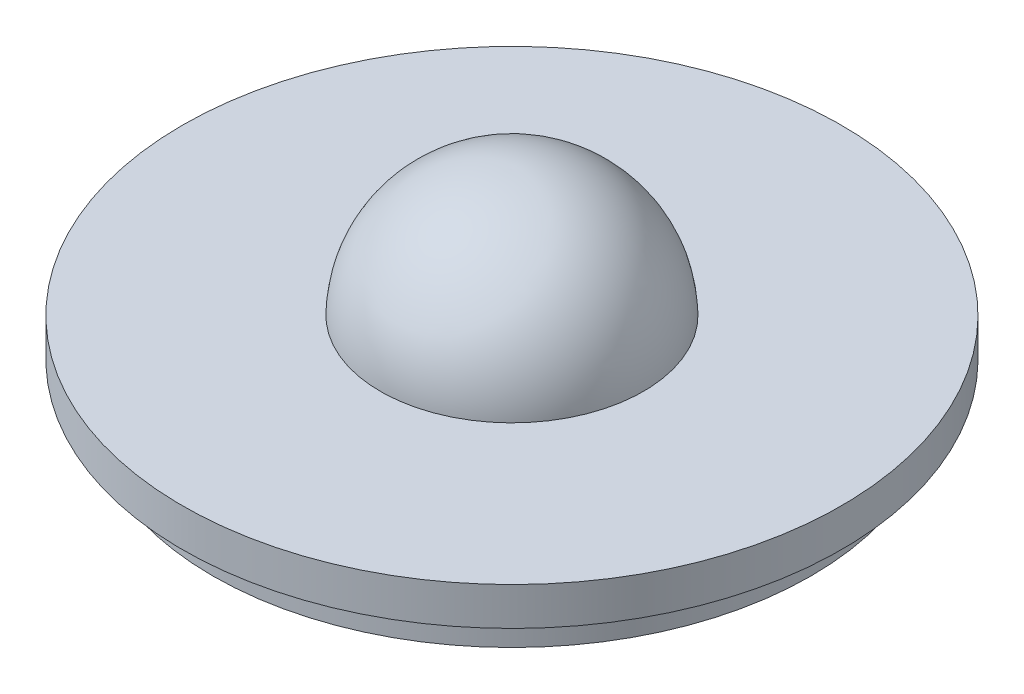
ISO-10303-21;
HEADER;
FILE_DESCRIPTION(('STEP AP214'),'2;1');
FILE_NAME('part.step','',(''),(''),'','','');
FILE_SCHEMA(('AUTOMOTIVE_DESIGN { 1 0 10303 214 1 1 1 1 }'));
ENDSEC;
DATA;
#1=APPLICATION_CONTEXT('core data for automotive mechanical design processes');
#2=APPLICATION_PROTOCOL_DEFINITION('international standard','automotive_design',2000,#1);
#3=PRODUCT_CONTEXT('',#1,'mechanical');
#4=PRODUCT('Part','Part','',(#3));
#5=PRODUCT_RELATED_PRODUCT_CATEGORY('part','',(#4));
#6=PRODUCT_DEFINITION_FORMATION('','',#4);
#7=PRODUCT_DEFINITION_CONTEXT('part definition',#1,'design');
#8=PRODUCT_DEFINITION('design','',#6,#7);
#9=PRODUCT_DEFINITION_SHAPE('','',#8);
#10=(LENGTH_UNIT() NAMED_UNIT(*) SI_UNIT(.MILLI.,.METRE.));
#11=(NAMED_UNIT(*) PLANE_ANGLE_UNIT() SI_UNIT($,.RADIAN.));
#12=(NAMED_UNIT(*) SI_UNIT($,.STERADIAN.) SOLID_ANGLE_UNIT());
#13=UNCERTAINTY_MEASURE_WITH_UNIT(LENGTH_MEASURE(1.E-05),#10,'distance_accuracy_value','');
#14=(GEOMETRIC_REPRESENTATION_CONTEXT(3) GLOBAL_UNCERTAINTY_ASSIGNED_CONTEXT((#13)) GLOBAL_UNIT_ASSIGNED_CONTEXT((#10,
#11,#12)) REPRESENTATION_CONTEXT('',''));
#15=CARTESIAN_POINT('',(0.,0.,0.));
#16=DIRECTION('',(0.,0.,1.));
#17=DIRECTION('',(1.,0.,0.));
#18=AXIS2_PLACEMENT_3D('',#15,#16,#17);
#19=CARTESIAN_POINT('',(-27.6916463371461,-4.77744807121662,0.));
#20=DIRECTION('',(0.,-1.,0.));
#21=DIRECTION('',(1.,0.,0.));
#22=AXIS2_PLACEMENT_3D('',#19,#20,#21);
#23=PLANE('',#22);
#24=CARTESIAN_POINT('',(-4.99164633714605,-4.77744807121662,0.));
#25=DIRECTION('',(0.,1.,0.));
#26=DIRECTION('',(-1.,0.,0.));
#27=AXIS2_PLACEMENT_3D('',#24,#25,#26);
#28=CIRCLE('',#27,22.7);
#29=CARTESIAN_POINT('',(-27.6916463371461,-4.77744807121662,0.));
#30=VERTEX_POINT('',#29);
#31=EDGE_CURVE('E70',#30,#30,#28,.T.);
#32=ORIENTED_EDGE('',*,*,#31,.T.);
#33=EDGE_LOOP('',(#32));
#34=FACE_BOUND('',#33,.T.);
#35=CARTESIAN_POINT('',(-4.99164633714605,-4.77744807121662,0.));
#36=DIRECTION('',(0.,1.,0.));
#37=DIRECTION('',(-1.,0.,0.));
#38=AXIS2_PLACEMENT_3D('',#35,#36,#37);
#39=CIRCLE('',#38,23.6);
#40=CARTESIAN_POINT('',(-28.5916463371461,-4.77744807121662,0.));
#41=VERTEX_POINT('',#40);
#42=EDGE_CURVE('E11',#41,#41,#39,.T.);
#43=ORIENTED_EDGE('',*,*,#42,.F.);
#44=EDGE_LOOP('',(#43));
#45=FACE_BOUND('',#44,.T.);
#46=ADVANCED_FACE('F33',(#34,#45),#23,.T.);
#47=CARTESIAN_POINT('',(-4.99164633714605,5.97539689223699,0.));
#48=DIRECTION('',(0.,1.,0.));
#49=DIRECTION('',(-1.,0.,0.));
#50=AXIS2_PLACEMENT_3D('',#47,#48,#49);
#51=CYLINDRICAL_SURFACE('',#50,23.6);
#52=ORIENTED_EDGE('',*,*,#42,.T.);
#53=EDGE_LOOP('',(#52));
#54=FACE_BOUND('',#53,.T.);
#55=CARTESIAN_POINT('',(-4.99164633714605,-1.77744807121662,0.));
#56=DIRECTION('',(0.,1.,0.));
#57=DIRECTION('',(-1.,0.,0.));
#58=AXIS2_PLACEMENT_3D('',#55,#56,#57);
#59=CIRCLE('',#58,23.6);
#60=CARTESIAN_POINT('',(-28.5916463371461,-1.77744807121662,0.));
#61=VERTEX_POINT('',#60);
#62=EDGE_CURVE('E39',#61,#61,#59,.T.);
#63=ORIENTED_EDGE('',*,*,#62,.F.);
#64=EDGE_LOOP('',(#63));
#65=FACE_BOUND('',#64,.T.);
#66=ADVANCED_FACE('F60',(#54,#65),#51,.T.);
#67=CARTESIAN_POINT('',(-28.5916463371461,-1.77744807121662,0.));
#68=DIRECTION('',(0.,-1.,0.));
#69=DIRECTION('',(1.,0.,0.));
#70=AXIS2_PLACEMENT_3D('',#67,#68,#69);
#71=PLANE('',#70);
#72=ORIENTED_EDGE('',*,*,#62,.T.);
#73=EDGE_LOOP('',(#72));
#74=FACE_BOUND('',#73,.T.);
#75=CARTESIAN_POINT('',(-4.99164633714605,-1.77744807121662,0.));
#76=DIRECTION('',(0.,1.,0.));
#77=DIRECTION('',(-1.,0.,0.));
#78=AXIS2_PLACEMENT_3D('',#75,#76,#77);
#79=CIRCLE('',#78,26.);
#80=CARTESIAN_POINT('',(-30.9916463371461,-1.77744807121662,0.));
#81=VERTEX_POINT('',#80);
#82=EDGE_CURVE('E76',#81,#81,#79,.T.);
#83=ORIENTED_EDGE('',*,*,#82,.F.);
#84=EDGE_LOOP('',(#83));
#85=FACE_BOUND('',#84,.T.);
#86=ADVANCED_FACE('F65',(#74,#85),#71,.T.);
#87=CARTESIAN_POINT('',(-4.99164633714605,5.97539689223699,0.));
#88=DIRECTION('',(0.,1.,0.));
#89=DIRECTION('',(-1.,0.,0.));
#90=AXIS2_PLACEMENT_3D('',#87,#88,#89);
#91=CYLINDRICAL_SURFACE('',#90,26.);
#92=ORIENTED_EDGE('',*,*,#82,.T.);
#93=EDGE_LOOP('',(#92));
#94=FACE_BOUND('',#93,.T.);
#95=CARTESIAN_POINT('',(-4.99164633714605,1.22255192878338,0.));
#96=DIRECTION('',(0.,1.,0.));
#97=DIRECTION('',(-1.,0.,0.));
#98=AXIS2_PLACEMENT_3D('',#95,#96,#97);
#99=CIRCLE('',#98,26.);
#100=CARTESIAN_POINT('',(-30.9916463371461,1.22255192878338,0.));
#101=VERTEX_POINT('',#100);
#102=EDGE_CURVE('E78',#101,#101,#99,.T.);
#103=ORIENTED_EDGE('',*,*,#102,.F.);
#104=EDGE_LOOP('',(#103));
#105=FACE_BOUND('',#104,.T.);
#106=ADVANCED_FACE('F55',(#94,#105),#91,.T.);
#107=CARTESIAN_POINT('',(-30.9916463371461,1.22255192878338,0.));
#108=DIRECTION('',(0.,1.,0.));
#109=DIRECTION('',(-1.,0.,0.));
#110=AXIS2_PLACEMENT_3D('',#107,#108,#109);
#111=PLANE('',#110);
#112=ORIENTED_EDGE('',*,*,#102,.T.);
#113=EDGE_LOOP('',(#112));
#114=FACE_BOUND('',#113,.T.);
#115=CARTESIAN_POINT('',(-4.99164633714605,1.22255192878338,0.));
#116=DIRECTION('',(0.,1.,0.));
#117=DIRECTION('',(-1.,0.,0.));
#118=AXIS2_PLACEMENT_3D('',#115,#116,#117);
#119=CIRCLE('',#118,10.3790216503141);
#120=CARTESIAN_POINT('',(-15.3706679874601,1.22255192878338,0.));
#121=VERTEX_POINT('',#120);
#122=EDGE_CURVE('E83',#121,#121,#119,.T.);
#123=ORIENTED_EDGE('',*,*,#122,.F.);
#124=EDGE_LOOP('',(#123));
#125=FACE_BOUND('',#124,.T.);
#126=ADVANCED_FACE('F45',(#114,#125),#111,.T.);
#127=CARTESIAN_POINT('',(-5.18115716230305,1.03304110362634,0.));
#128=DIRECTION('',(0.,0.,-1.));
#129=DIRECTION('',(-1.,0.,0.));
#130=AXIS2_PLACEMENT_3D('',#127,#128,#129);
#131=CIRCLE('',#130,10.1912729925581);
#132=TRIMMED_CURVE('',#131,(PARAMETER_VALUE(-1.58939280132643)),
(PARAMETER_VALUE(1.58939280132643)),.T.,.PARAMETER.);
#133=CARTESIAN_POINT('',(-4.99164633714605,1.03304110362634,0.));
#134=DIRECTION('',(0.,1.,0.));
#135=AXIS1_PLACEMENT('',#133,#134);
#136=SURFACE_OF_REVOLUTION('',#132,#135);
#137=ORIENTED_EDGE('',*,*,#122,.T.);
#138=EDGE_LOOP('',(#137));
#139=FACE_BOUND('',#138,.T.);
#140=CARTESIAN_POINT('',(-4.99164633714605,11.2225519287834,0.));
#141=VERTEX_POINT('',#140);
#142=VERTEX_LOOP('',#141);
#143=FACE_BOUND('',#142,.T.);
#144=ADVANCED_FACE('F42',(#139,#143),#136,.T.);
#145=CARTESIAN_POINT('',(-27.6916463371461,-1.77744807121662,0.));
#146=DIRECTION('',(0.,-1.,0.));
#147=DIRECTION('',(1.,0.,0.));
#148=AXIS2_PLACEMENT_3D('',#145,#146,#147);
#149=PLANE('',#148);
#150=CARTESIAN_POINT('',(-4.99164633714605,-1.77744807121662,0.));
#151=DIRECTION('',(0.,1.,0.));
#152=DIRECTION('',(-1.,0.,0.));
#153=AXIS2_PLACEMENT_3D('',#150,#151,#152);
#154=CIRCLE('',#153,22.7);
#155=CARTESIAN_POINT('',(-27.6916463371461,-1.77744807121662,0.));
#156=VERTEX_POINT('',#155);
#157=EDGE_CURVE('E85',#156,#156,#154,.T.);
#158=ORIENTED_EDGE('',*,*,#157,.F.);
#159=EDGE_LOOP('',(#158));
#160=FACE_BOUND('',#159,.T.);
#161=ADVANCED_FACE('F44',(#160),#149,.T.);
#162=CARTESIAN_POINT('',(-4.99164633714605,5.97539689223699,0.));
#163=DIRECTION('',(0.,1.,0.));
#164=DIRECTION('',(-1.,0.,0.));
#165=AXIS2_PLACEMENT_3D('',#162,#163,#164);
#166=CYLINDRICAL_SURFACE('',#165,22.7);
#167=ORIENTED_EDGE('',*,*,#157,.T.);
#168=EDGE_LOOP('',(#167));
#169=FACE_BOUND('',#168,.T.);
#170=ORIENTED_EDGE('',*,*,#31,.F.);
#171=EDGE_LOOP('',(#170));
#172=FACE_BOUND('',#171,.T.);
#173=ADVANCED_FACE('F52',(#169,#172),#166,.F.);
#174=CLOSED_SHELL('',(#46,#66,#86,#106,#126,#144,#161,#173));
#175=MANIFOLD_SOLID_BREP('B2',#174);
#176=ADVANCED_BREP_SHAPE_REPRESENTATION('',(#18,#175),#14);
#177=SHAPE_DEFINITION_REPRESENTATION(#9,#176);
ENDSEC;
END-ISO-10303-21;
